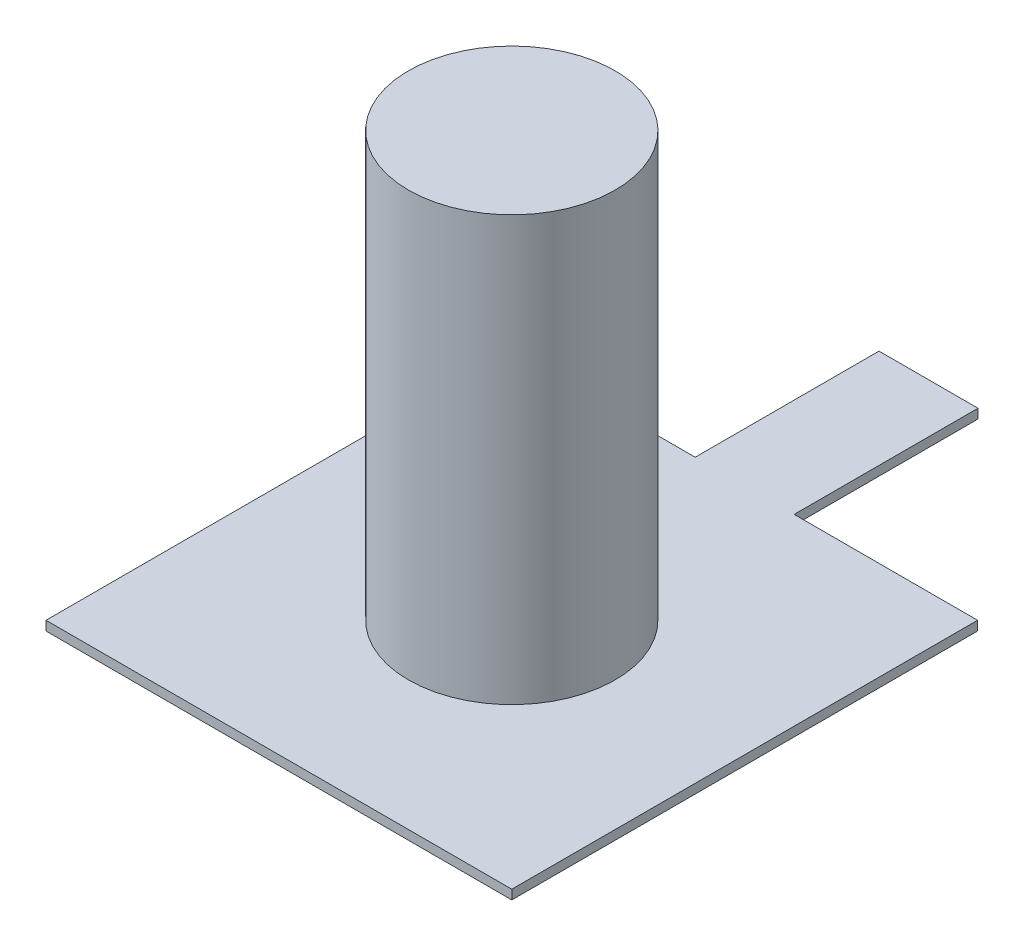
ISO-10303-21;
HEADER;
FILE_DESCRIPTION(('STEP AP214'),'2;1');
FILE_NAME('part.step','',(''),(''),'','','');
FILE_SCHEMA(('AUTOMOTIVE_DESIGN { 1 0 10303 214 1 1 1 1 }'));
ENDSEC;
DATA;
#1=APPLICATION_CONTEXT('core data for automotive mechanical design processes');
#2=APPLICATION_PROTOCOL_DEFINITION('international standard','automotive_design',2000,#1);
#3=PRODUCT_CONTEXT('',#1,'mechanical');
#4=PRODUCT('Part','Part','',(#3));
#5=PRODUCT_RELATED_PRODUCT_CATEGORY('part','',(#4));
#6=PRODUCT_DEFINITION_FORMATION('','',#4);
#7=PRODUCT_DEFINITION_CONTEXT('part definition',#1,'design');
#8=PRODUCT_DEFINITION('design','',#6,#7);
#9=PRODUCT_DEFINITION_SHAPE('','',#8);
#10=(LENGTH_UNIT() NAMED_UNIT(*) SI_UNIT(.MILLI.,.METRE.));
#11=(NAMED_UNIT(*) PLANE_ANGLE_UNIT() SI_UNIT($,.RADIAN.));
#12=(NAMED_UNIT(*) SI_UNIT($,.STERADIAN.) SOLID_ANGLE_UNIT());
#13=UNCERTAINTY_MEASURE_WITH_UNIT(LENGTH_MEASURE(1.E-05),#10,'distance_accuracy_value','');
#14=(GEOMETRIC_REPRESENTATION_CONTEXT(3) GLOBAL_UNCERTAINTY_ASSIGNED_CONTEXT((#13)) GLOBAL_UNIT_ASSIGNED_CONTEXT((#10,
#11,#12)) REPRESENTATION_CONTEXT('',''));
#15=CARTESIAN_POINT('',(0.,0.,0.));
#16=DIRECTION('',(0.,0.,1.));
#17=DIRECTION('',(1.,0.,0.));
#18=AXIS2_PLACEMENT_3D('',#15,#16,#17);
#19=CARTESIAN_POINT('',(0.,0.33,0.));
#20=DIRECTION('',(1.,0.,0.));
#21=DIRECTION('',(0.,0.,-1.));
#22=AXIS2_PLACEMENT_3D('',#19,#20,#21);
#23=PLANE('',#22);
#24=DIRECTION('',(0.,0.,1.));
#25=VECTOR('',#24,1.);
#26=CARTESIAN_POINT('',(0.,0.,0.));
#27=LINE('',#26,#25);
#28=CARTESIAN_POINT('',(0.,0.,-16.47));
#29=VERTEX_POINT('',#28);
#30=CARTESIAN_POINT('',(0.,0.,0.));
#31=VERTEX_POINT('',#30);
#32=EDGE_CURVE('E142',#29,#31,#27,.T.);
#33=ORIENTED_EDGE('',*,*,#32,.T.);
#34=DIRECTION('',(0.,-1.,0.));
#35=VECTOR('',#34,1.);
#36=CARTESIAN_POINT('',(0.,0.33,0.));
#37=LINE('',#36,#35);
#38=CARTESIAN_POINT('',(0.,0.33,0.));
#39=VERTEX_POINT('',#38);
#40=EDGE_CURVE('E42',#39,#31,#37,.T.);
#41=ORIENTED_EDGE('',*,*,#40,.F.);
#42=DIRECTION('',(0.,0.,1.));
#43=VECTOR('',#42,1.);
#44=CARTESIAN_POINT('',(0.,0.33,0.));
#45=LINE('',#44,#43);
#46=CARTESIAN_POINT('',(0.,0.33,-16.47));
#47=VERTEX_POINT('',#46);
#48=EDGE_CURVE('E165',#47,#39,#45,.T.);
#49=ORIENTED_EDGE('',*,*,#48,.F.);
#50=DIRECTION('',(0.,-1.,0.));
#51=VECTOR('',#50,1.);
#52=CARTESIAN_POINT('',(0.,0.33,-16.47));
#53=LINE('',#52,#51);
#54=EDGE_CURVE('E138',#47,#29,#53,.T.);
#55=ORIENTED_EDGE('',*,*,#54,.T.);
#56=EDGE_LOOP('',(#33,#41,#49,#55));
#57=FACE_BOUND('',#56,.T.);
#58=ADVANCED_FACE('F39',(#57),#23,.F.);
#59=CARTESIAN_POINT('',(0.,0.33,0.));
#60=DIRECTION('',(0.,0.,-1.));
#61=DIRECTION('',(-1.,0.,0.));
#62=AXIS2_PLACEMENT_3D('',#59,#60,#61);
#63=PLANE('',#62);
#64=DIRECTION('',(1.,0.,0.));
#65=VECTOR('',#64,1.);
#66=CARTESIAN_POINT('',(0.,0.,0.));
#67=LINE('',#66,#65);
#68=CARTESIAN_POINT('',(16.47,0.,0.));
#69=VERTEX_POINT('',#68);
#70=EDGE_CURVE('E146',#31,#69,#67,.T.);
#71=ORIENTED_EDGE('',*,*,#70,.T.);
#72=DIRECTION('',(0.,-1.,0.));
#73=VECTOR('',#72,1.);
#74=CARTESIAN_POINT('',(16.47,0.33,0.));
#75=LINE('',#74,#73);
#76=CARTESIAN_POINT('',(16.47,0.33,0.));
#77=VERTEX_POINT('',#76);
#78=EDGE_CURVE('E179',#77,#69,#75,.T.);
#79=ORIENTED_EDGE('',*,*,#78,.F.);
#80=DIRECTION('',(1.,0.,0.));
#81=VECTOR('',#80,1.);
#82=CARTESIAN_POINT('',(0.,0.33,0.));
#83=LINE('',#82,#81);
#84=EDGE_CURVE('E101',#39,#77,#83,.T.);
#85=ORIENTED_EDGE('',*,*,#84,.F.);
#86=ORIENTED_EDGE('',*,*,#40,.T.);
#87=EDGE_LOOP('',(#71,#79,#85,#86));
#88=FACE_BOUND('',#87,.T.);
#89=ADVANCED_FACE('F187',(#88),#63,.F.);
#90=CARTESIAN_POINT('',(16.47,0.33,0.));
#91=DIRECTION('',(-1.,0.,0.));
#92=DIRECTION('',(0.,0.,1.));
#93=AXIS2_PLACEMENT_3D('',#90,#91,#92);
#94=PLANE('',#93);
#95=DIRECTION('',(0.,0.,-1.));
#96=VECTOR('',#95,1.);
#97=CARTESIAN_POINT('',(16.47,0.,0.));
#98=LINE('',#97,#96);
#99=CARTESIAN_POINT('',(16.47,0.,-16.47));
#100=VERTEX_POINT('',#99);
#101=EDGE_CURVE('E150',#69,#100,#98,.T.);
#102=ORIENTED_EDGE('',*,*,#101,.T.);
#103=DIRECTION('',(0.,-1.,0.));
#104=VECTOR('',#103,1.);
#105=CARTESIAN_POINT('',(16.47,0.33,-16.47));
#106=LINE('',#105,#104);
#107=CARTESIAN_POINT('',(16.47,0.33,-16.47));
#108=VERTEX_POINT('',#107);
#109=EDGE_CURVE('E176',#108,#100,#106,.T.);
#110=ORIENTED_EDGE('',*,*,#109,.F.);
#111=DIRECTION('',(0.,0.,-1.));
#112=VECTOR('',#111,1.);
#113=CARTESIAN_POINT('',(16.47,0.33,0.));
#114=LINE('',#113,#112);
#115=EDGE_CURVE('E203',#77,#108,#114,.T.);
#116=ORIENTED_EDGE('',*,*,#115,.F.);
#117=ORIENTED_EDGE('',*,*,#78,.T.);
#118=EDGE_LOOP('',(#102,#110,#116,#117));
#119=FACE_BOUND('',#118,.T.);
#120=ADVANCED_FACE('F196',(#119),#94,.F.);
#121=CARTESIAN_POINT('',(9.985,0.33,-16.47));
#122=DIRECTION('',(0.,0.,1.));
#123=DIRECTION('',(1.,0.,0.));
#124=AXIS2_PLACEMENT_3D('',#121,#122,#123);
#125=PLANE('',#124);
#126=DIRECTION('',(-1.,0.,0.));
#127=VECTOR('',#126,1.);
#128=CARTESIAN_POINT('',(9.985,0.,-16.47));
#129=LINE('',#128,#127);
#130=CARTESIAN_POINT('',(9.985,0.,-16.47));
#131=VERTEX_POINT('',#130);
#132=EDGE_CURVE('E153',#100,#131,#129,.T.);
#133=ORIENTED_EDGE('',*,*,#132,.T.);
#134=DIRECTION('',(0.,-1.,0.));
#135=VECTOR('',#134,1.);
#136=CARTESIAN_POINT('',(9.985,0.33,-16.47));
#137=LINE('',#136,#135);
#138=CARTESIAN_POINT('',(9.985,0.33,-16.47));
#139=VERTEX_POINT('',#138);
#140=EDGE_CURVE('E172',#139,#131,#137,.T.);
#141=ORIENTED_EDGE('',*,*,#140,.F.);
#142=DIRECTION('',(-1.,0.,0.));
#143=VECTOR('',#142,1.);
#144=CARTESIAN_POINT('',(9.985,0.33,-16.47));
#145=LINE('',#144,#143);
#146=EDGE_CURVE('E201',#108,#139,#145,.T.);
#147=ORIENTED_EDGE('',*,*,#146,.F.);
#148=ORIENTED_EDGE('',*,*,#109,.T.);
#149=EDGE_LOOP('',(#133,#141,#147,#148));
#150=FACE_BOUND('',#149,.T.);
#151=ADVANCED_FACE('F199',(#150),#125,.F.);
#152=CARTESIAN_POINT('',(9.985,0.33,-22.97));
#153=DIRECTION('',(-1.,0.,0.));
#154=DIRECTION('',(0.,0.,1.));
#155=AXIS2_PLACEMENT_3D('',#152,#153,#154);
#156=PLANE('',#155);
#157=DIRECTION('',(0.,0.,-1.));
#158=VECTOR('',#157,1.);
#159=CARTESIAN_POINT('',(9.985,0.,-22.97));
#160=LINE('',#159,#158);
#161=CARTESIAN_POINT('',(9.985,0.,-22.97));
#162=VERTEX_POINT('',#161);
#163=EDGE_CURVE('E156',#131,#162,#160,.T.);
#164=ORIENTED_EDGE('',*,*,#163,.T.);
#165=DIRECTION('',(0.,-1.,0.));
#166=VECTOR('',#165,1.);
#167=CARTESIAN_POINT('',(9.985,0.33,-22.97));
#168=LINE('',#167,#166);
#169=CARTESIAN_POINT('',(9.985,0.33,-22.97));
#170=VERTEX_POINT('',#169);
#171=EDGE_CURVE('E131',#170,#162,#168,.T.);
#172=ORIENTED_EDGE('',*,*,#171,.F.);
#173=DIRECTION('',(0.,0.,-1.));
#174=VECTOR('',#173,1.);
#175=CARTESIAN_POINT('',(9.985,0.33,-22.97));
#176=LINE('',#175,#174);
#177=EDGE_CURVE('E120',#139,#170,#176,.T.);
#178=ORIENTED_EDGE('',*,*,#177,.F.);
#179=ORIENTED_EDGE('',*,*,#140,.T.);
#180=EDGE_LOOP('',(#164,#172,#178,#179));
#181=FACE_BOUND('',#180,.T.);
#182=ADVANCED_FACE('F245',(#181),#156,.F.);
#183=CARTESIAN_POINT('',(6.485,0.33,-22.97));
#184=DIRECTION('',(0.,0.,1.));
#185=DIRECTION('',(1.,0.,0.));
#186=AXIS2_PLACEMENT_3D('',#183,#184,#185);
#187=PLANE('',#186);
#188=DIRECTION('',(-1.,0.,0.));
#189=VECTOR('',#188,1.);
#190=CARTESIAN_POINT('',(6.485,0.,-22.97));
#191=LINE('',#190,#189);
#192=CARTESIAN_POINT('',(6.485,0.,-22.97));
#193=VERTEX_POINT('',#192);
#194=EDGE_CURVE('E129',#162,#193,#191,.T.);
#195=ORIENTED_EDGE('',*,*,#194,.T.);
#196=DIRECTION('',(0.,-1.,0.));
#197=VECTOR('',#196,1.);
#198=CARTESIAN_POINT('',(6.485,0.33,-22.97));
#199=LINE('',#198,#197);
#200=CARTESIAN_POINT('',(6.485,0.33,-22.97));
#201=VERTEX_POINT('',#200);
#202=EDGE_CURVE('E126',#201,#193,#199,.T.);
#203=ORIENTED_EDGE('',*,*,#202,.F.);
#204=DIRECTION('',(-1.,0.,0.));
#205=VECTOR('',#204,1.);
#206=CARTESIAN_POINT('',(6.485,0.33,-22.97));
#207=LINE('',#206,#205);
#208=EDGE_CURVE('E114',#170,#201,#207,.T.);
#209=ORIENTED_EDGE('',*,*,#208,.F.);
#210=ORIENTED_EDGE('',*,*,#171,.T.);
#211=EDGE_LOOP('',(#195,#203,#209,#210));
#212=FACE_BOUND('',#211,.T.);
#213=ADVANCED_FACE('F127',(#212),#187,.F.);
#214=CARTESIAN_POINT('',(6.485,0.33,-16.47));
#215=DIRECTION('',(1.,0.,0.));
#216=DIRECTION('',(0.,0.,-1.));
#217=AXIS2_PLACEMENT_3D('',#214,#215,#216);
#218=PLANE('',#217);
#219=DIRECTION('',(0.,0.,1.));
#220=VECTOR('',#219,1.);
#221=CARTESIAN_POINT('',(6.485,0.,-16.47));
#222=LINE('',#221,#220);
#223=CARTESIAN_POINT('',(6.485,0.,-16.47));
#224=VERTEX_POINT('',#223);
#225=EDGE_CURVE('E86',#193,#224,#222,.T.);
#226=ORIENTED_EDGE('',*,*,#225,.T.);
#227=DIRECTION('',(0.,-1.,0.));
#228=VECTOR('',#227,1.);
#229=CARTESIAN_POINT('',(6.485,0.33,-16.47));
#230=LINE('',#229,#228);
#231=CARTESIAN_POINT('',(6.485,0.33,-16.47));
#232=VERTEX_POINT('',#231);
#233=EDGE_CURVE('E132',#232,#224,#230,.T.);
#234=ORIENTED_EDGE('',*,*,#233,.F.);
#235=DIRECTION('',(0.,0.,1.));
#236=VECTOR('',#235,1.);
#237=CARTESIAN_POINT('',(6.485,0.33,-16.47));
#238=LINE('',#237,#236);
#239=EDGE_CURVE('E118',#201,#232,#238,.T.);
#240=ORIENTED_EDGE('',*,*,#239,.F.);
#241=ORIENTED_EDGE('',*,*,#202,.T.);
#242=EDGE_LOOP('',(#226,#234,#240,#241));
#243=FACE_BOUND('',#242,.T.);
#244=ADVANCED_FACE('F134',(#243),#218,.F.);
#245=CARTESIAN_POINT('',(6.485,0.33,-16.47));
#246=DIRECTION('',(0.,0.,1.));
#247=DIRECTION('',(1.,0.,0.));
#248=AXIS2_PLACEMENT_3D('',#245,#246,#247);
#249=PLANE('',#248);
#250=DIRECTION('',(-1.,0.,0.));
#251=VECTOR('',#250,1.);
#252=CARTESIAN_POINT('',(6.485,0.,-16.47));
#253=LINE('',#252,#251);
#254=EDGE_CURVE('E92',#224,#29,#253,.T.);
#255=ORIENTED_EDGE('',*,*,#254,.T.);
#256=ORIENTED_EDGE('',*,*,#54,.F.);
#257=DIRECTION('',(-1.,0.,0.));
#258=VECTOR('',#257,1.);
#259=CARTESIAN_POINT('',(6.485,0.33,-16.47));
#260=LINE('',#259,#258);
#261=EDGE_CURVE('E57',#232,#47,#260,.T.);
#262=ORIENTED_EDGE('',*,*,#261,.F.);
#263=ORIENTED_EDGE('',*,*,#233,.T.);
#264=EDGE_LOOP('',(#255,#256,#262,#263));
#265=FACE_BOUND('',#264,.T.);
#266=ADVANCED_FACE('F226',(#265),#249,.F.);
#267=CARTESIAN_POINT('',(0.,0.33,0.));
#268=DIRECTION('',(0.,1.,0.));
#269=DIRECTION('',(0.,0.,1.));
#270=AXIS2_PLACEMENT_3D('',#267,#268,#269);
#271=PLANE('',#270);
#272=CARTESIAN_POINT('',(8.235,0.33,-8.235));
#273=DIRECTION('',(0.,1.,0.));
#274=DIRECTION('',(0.,0.,1.));
#275=AXIS2_PLACEMENT_3D('',#272,#273,#274);
#276=CIRCLE('',#275,3.655);
#277=CARTESIAN_POINT('',(8.235,0.33,-4.58));
#278=VERTEX_POINT('',#277);
#279=EDGE_CURVE('E11',#278,#278,#276,.T.);
#280=ORIENTED_EDGE('',*,*,#279,.F.);
#281=EDGE_LOOP('',(#280));
#282=FACE_BOUND('',#281,.T.);
#283=ORIENTED_EDGE('',*,*,#48,.T.);
#284=ORIENTED_EDGE('',*,*,#84,.T.);
#285=ORIENTED_EDGE('',*,*,#115,.T.);
#286=ORIENTED_EDGE('',*,*,#146,.T.);
#287=ORIENTED_EDGE('',*,*,#177,.T.);
#288=ORIENTED_EDGE('',*,*,#208,.T.);
#289=ORIENTED_EDGE('',*,*,#239,.T.);
#290=ORIENTED_EDGE('',*,*,#261,.T.);
#291=EDGE_LOOP('',(#283,#284,#285,#286,#287,#288,#289,#290));
#292=FACE_BOUND('',#291,.T.);
#293=ADVANCED_FACE('F116',(#282,#292),#271,.T.);
#294=CARTESIAN_POINT('',(0.,0.,0.));
#295=DIRECTION('',(0.,1.,0.));
#296=DIRECTION('',(0.,0.,1.));
#297=AXIS2_PLACEMENT_3D('',#294,#295,#296);
#298=PLANE('',#297);
#299=ORIENTED_EDGE('',*,*,#32,.F.);
#300=ORIENTED_EDGE('',*,*,#254,.F.);
#301=ORIENTED_EDGE('',*,*,#225,.F.);
#302=ORIENTED_EDGE('',*,*,#194,.F.);
#303=ORIENTED_EDGE('',*,*,#163,.F.);
#304=ORIENTED_EDGE('',*,*,#132,.F.);
#305=ORIENTED_EDGE('',*,*,#101,.F.);
#306=ORIENTED_EDGE('',*,*,#70,.F.);
#307=EDGE_LOOP('',(#299,#300,#301,#302,#303,#304,#305,#306));
#308=FACE_BOUND('',#307,.T.);
#309=ADVANCED_FACE('F192',(#308),#298,.F.);
#310=CARTESIAN_POINT('',(8.235,15.33,-8.235));
#311=DIRECTION('',(0.,-1.,0.));
#312=DIRECTION('',(0.,0.,-1.));
#313=AXIS2_PLACEMENT_3D('',#310,#311,#312);
#314=CYLINDRICAL_SURFACE('',#313,3.655);
#315=CARTESIAN_POINT('',(8.235,15.33,-8.235));
#316=DIRECTION('',(0.,1.,0.));
#317=DIRECTION('',(0.,0.,1.));
#318=AXIS2_PLACEMENT_3D('',#315,#316,#317);
#319=CIRCLE('',#318,3.655);
#320=CARTESIAN_POINT('',(8.235,15.33,-4.58));
#321=VERTEX_POINT('',#320);
#322=EDGE_CURVE('E147',#321,#321,#319,.T.);
#323=ORIENTED_EDGE('',*,*,#322,.F.);
#324=EDGE_LOOP('',(#323));
#325=FACE_BOUND('',#324,.T.);
#326=ORIENTED_EDGE('',*,*,#279,.T.);
#327=EDGE_LOOP('',(#326));
#328=FACE_BOUND('',#327,.T.);
#329=ADVANCED_FACE('F219',(#325,#328),#314,.T.);
#330=CARTESIAN_POINT('',(8.235,15.33,-8.235));
#331=DIRECTION('',(0.,1.,0.));
#332=DIRECTION('',(0.,0.,1.));
#333=AXIS2_PLACEMENT_3D('',#330,#331,#332);
#334=PLANE('',#333);
#335=ORIENTED_EDGE('',*,*,#322,.T.);
#336=EDGE_LOOP('',(#335));
#337=FACE_BOUND('',#336,.T.);
#338=ADVANCED_FACE('F217',(#337),#334,.T.);
#339=CLOSED_SHELL('',(#58,#89,#120,#151,#182,#213,#244,#266,#293,#309,#329,#338));
#340=MANIFOLD_SOLID_BREP('B2',#339);
#341=ADVANCED_BREP_SHAPE_REPRESENTATION('',(#18,#340),#14);
#342=SHAPE_DEFINITION_REPRESENTATION(#9,#341);
ENDSEC;
END-ISO-10303-21;
